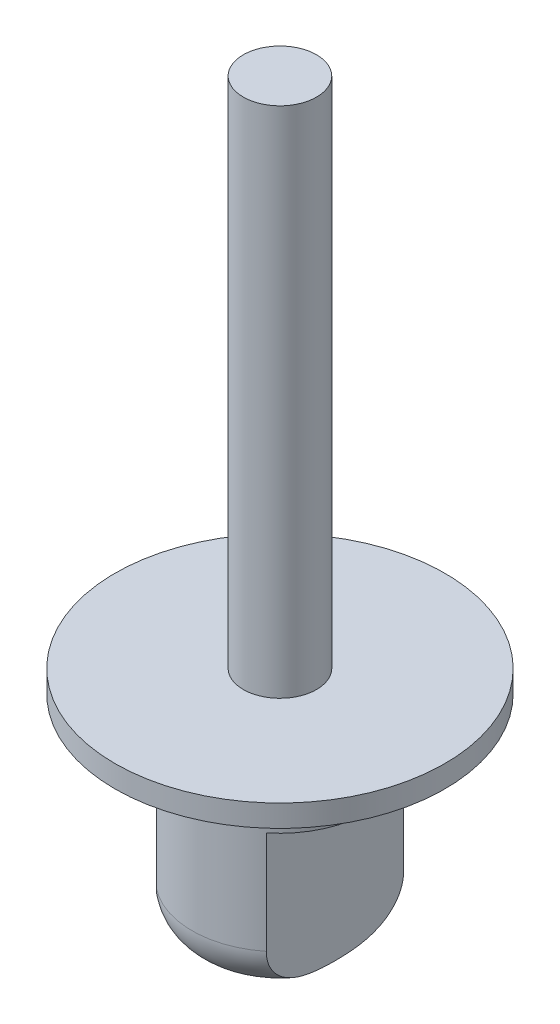
ISO-10303-21;
HEADER;
FILE_DESCRIPTION(('STEP AP214'),'2;1');
FILE_NAME('part.step','',(''),(''),'','','');
FILE_SCHEMA(('AUTOMOTIVE_DESIGN { 1 0 10303 214 1 1 1 1 }'));
ENDSEC;
DATA;
#1=APPLICATION_CONTEXT('core data for automotive mechanical design processes');
#2=APPLICATION_PROTOCOL_DEFINITION('international standard','automotive_design',2000,#1);
#3=PRODUCT_CONTEXT('',#1,'mechanical');
#4=PRODUCT('Part','Part','',(#3));
#5=PRODUCT_RELATED_PRODUCT_CATEGORY('part','',(#4));
#6=PRODUCT_DEFINITION_FORMATION('','',#4);
#7=PRODUCT_DEFINITION_CONTEXT('part definition',#1,'design');
#8=PRODUCT_DEFINITION('design','',#6,#7);
#9=PRODUCT_DEFINITION_SHAPE('','',#8);
#10=(LENGTH_UNIT() NAMED_UNIT(*) SI_UNIT(.MILLI.,.METRE.));
#11=(NAMED_UNIT(*) PLANE_ANGLE_UNIT() SI_UNIT($,.RADIAN.));
#12=(NAMED_UNIT(*) SI_UNIT($,.STERADIAN.) SOLID_ANGLE_UNIT());
#13=UNCERTAINTY_MEASURE_WITH_UNIT(LENGTH_MEASURE(1.E-05),#10,'distance_accuracy_value','');
#14=(GEOMETRIC_REPRESENTATION_CONTEXT(3) GLOBAL_UNCERTAINTY_ASSIGNED_CONTEXT((#13)) GLOBAL_UNIT_ASSIGNED_CONTEXT((#10,
#11,#12)) REPRESENTATION_CONTEXT('',''));
#15=CARTESIAN_POINT('',(0.,0.,0.));
#16=DIRECTION('',(0.,0.,1.));
#17=DIRECTION('',(1.,0.,0.));
#18=AXIS2_PLACEMENT_3D('',#15,#16,#17);
#19=CARTESIAN_POINT('',(0.,3.,0.));
#20=DIRECTION('',(0.,-1.,0.));
#21=DIRECTION('',(0.,0.,-1.));
#22=AXIS2_PLACEMENT_3D('',#19,#20,#21);
#23=CYLINDRICAL_SURFACE('',#22,22.5);
#24=CARTESIAN_POINT('',(0.,3.,0.));
#25=DIRECTION('',(0.,1.,0.));
#26=DIRECTION('',(0.,0.,1.));
#27=AXIS2_PLACEMENT_3D('',#24,#25,#26);
#28=CIRCLE('',#27,22.5);
#29=CARTESIAN_POINT('',(0.,3.,22.5));
#30=VERTEX_POINT('',#29);
#31=EDGE_CURVE('E126',#30,#30,#28,.T.);
#32=ORIENTED_EDGE('',*,*,#31,.F.);
#33=EDGE_LOOP('',(#32));
#34=FACE_BOUND('',#33,.T.);
#35=CARTESIAN_POINT('',(0.,0.,0.));
#36=DIRECTION('',(0.,1.,0.));
#37=DIRECTION('',(0.,0.,1.));
#38=AXIS2_PLACEMENT_3D('',#35,#36,#37);
#39=CIRCLE('',#38,22.5);
#40=CARTESIAN_POINT('',(0.,0.,22.5));
#41=VERTEX_POINT('',#40);
#42=EDGE_CURVE('E122',#41,#41,#39,.T.);
#43=ORIENTED_EDGE('',*,*,#42,.T.);
#44=EDGE_LOOP('',(#43));
#45=FACE_BOUND('',#44,.T.);
#46=ADVANCED_FACE('F39',(#34,#45),#23,.T.);
#47=CARTESIAN_POINT('',(0.,3.,0.));
#48=DIRECTION('',(0.,1.,0.));
#49=DIRECTION('',(0.,0.,1.));
#50=AXIS2_PLACEMENT_3D('',#47,#48,#49);
#51=PLANE('',#50);
#52=CARTESIAN_POINT('',(0.,3.,0.));
#53=DIRECTION('',(0.,1.,0.));
#54=DIRECTION('',(0.,0.,1.));
#55=AXIS2_PLACEMENT_3D('',#52,#53,#54);
#56=CIRCLE('',#55,5.);
#57=CARTESIAN_POINT('',(0.,3.,5.));
#58=VERTEX_POINT('',#57);
#59=EDGE_CURVE('E118',#58,#58,#56,.T.);
#60=ORIENTED_EDGE('',*,*,#59,.F.);
#61=EDGE_LOOP('',(#60));
#62=FACE_BOUND('',#61,.T.);
#63=ORIENTED_EDGE('',*,*,#31,.T.);
#64=EDGE_LOOP('',(#63));
#65=FACE_BOUND('',#64,.T.);
#66=ADVANCED_FACE('F171',(#62,#65),#51,.T.);
#67=CARTESIAN_POINT('',(0.,0.,0.));
#68=DIRECTION('',(0.,1.,0.));
#69=DIRECTION('',(0.,0.,1.));
#70=AXIS2_PLACEMENT_3D('',#67,#68,#69);
#71=PLANE('',#70);
#72=CARTESIAN_POINT('',(0.,0.,0.));
#73=DIRECTION('',(0.,-1.,0.));
#74=DIRECTION('',(0.,0.,-1.));
#75=AXIS2_PLACEMENT_3D('',#72,#73,#74);
#76=CIRCLE('',#75,12.);
#77=CARTESIAN_POINT('',(0.,0.,-12.));
#78=VERTEX_POINT('',#77);
#79=EDGE_CURVE('E113',#78,#78,#76,.T.);
#80=ORIENTED_EDGE('',*,*,#79,.F.);
#81=EDGE_LOOP('',(#80));
#82=FACE_BOUND('',#81,.T.);
#83=ORIENTED_EDGE('',*,*,#42,.F.);
#84=EDGE_LOOP('',(#83));
#85=FACE_BOUND('',#84,.T.);
#86=ADVANCED_FACE('F169',(#82,#85),#71,.F.);
#87=CARTESIAN_POINT('',(0.,73.,0.));
#88=DIRECTION('',(0.,-1.,0.));
#89=DIRECTION('',(0.,0.,-1.));
#90=AXIS2_PLACEMENT_3D('',#87,#88,#89);
#91=CYLINDRICAL_SURFACE('',#90,5.);
#92=CARTESIAN_POINT('',(0.,73.,0.));
#93=DIRECTION('',(0.,1.,0.));
#94=DIRECTION('',(0.,0.,1.));
#95=AXIS2_PLACEMENT_3D('',#92,#93,#94);
#96=CIRCLE('',#95,5.);
#97=CARTESIAN_POINT('',(0.,73.,5.));
#98=VERTEX_POINT('',#97);
#99=EDGE_CURVE('E112',#98,#98,#96,.T.);
#100=ORIENTED_EDGE('',*,*,#99,.F.);
#101=EDGE_LOOP('',(#100));
#102=FACE_BOUND('',#101,.T.);
#103=ORIENTED_EDGE('',*,*,#59,.T.);
#104=EDGE_LOOP('',(#103));
#105=FACE_BOUND('',#104,.T.);
#106=ADVANCED_FACE('F165',(#102,#105),#91,.T.);
#107=CARTESIAN_POINT('',(0.,73.,0.));
#108=DIRECTION('',(0.,1.,0.));
#109=DIRECTION('',(0.,0.,1.));
#110=AXIS2_PLACEMENT_3D('',#107,#108,#109);
#111=PLANE('',#110);
#112=ORIENTED_EDGE('',*,*,#99,.T.);
#113=EDGE_LOOP('',(#112));
#114=FACE_BOUND('',#113,.T.);
#115=ADVANCED_FACE('F162',(#114),#111,.T.);
#116=CARTESIAN_POINT('',(0.,-28.,0.));
#117=DIRECTION('',(0.,1.,0.));
#118=DIRECTION('',(0.,0.,1.));
#119=AXIS2_PLACEMENT_3D('',#116,#117,#118);
#120=CYLINDRICAL_SURFACE('',#119,12.);
#121=CARTESIAN_POINT('',(0.,-22.,0.));
#122=DIRECTION('',(0.,-1.,0.));
#123=DIRECTION('',(0.,0.,-1.));
#124=AXIS2_PLACEMENT_3D('',#121,#122,#123);
#125=CIRCLE('',#124,12.);
#126=CARTESIAN_POINT('',(-7.5,-21.9999999999999,9.36749699759766));
#127=VERTEX_POINT('',#126);
#128=CARTESIAN_POINT('',(7.5,-22.,9.3674969975976));
#129=VERTEX_POINT('',#128);
#130=EDGE_CURVE('E138',#127,#129,#125,.F.);
#131=ORIENTED_EDGE('',*,*,#130,.T.);
#132=DIRECTION('',(0.,1.,0.));
#133=VECTOR('',#132,1.);
#134=CARTESIAN_POINT('',(7.5,-28.,9.3674969975976));
#135=LINE('',#134,#133);
#136=CARTESIAN_POINT('',(7.5,-8.,9.36749699759759));
#137=VERTEX_POINT('',#136);
#138=EDGE_CURVE('E56',#129,#137,#135,.T.);
#139=ORIENTED_EDGE('',*,*,#138,.T.);
#140=CARTESIAN_POINT('',(0.,-8.,0.));
#141=DIRECTION('',(0.,1.,0.));
#142=DIRECTION('',(-1.,0.,0.));
#143=AXIS2_PLACEMENT_3D('',#140,#141,#142);
#144=CIRCLE('',#143,12.);
#145=CARTESIAN_POINT('',(7.5,-8.,-9.3674969975976));
#146=VERTEX_POINT('',#145);
#147=EDGE_CURVE('E11',#137,#146,#144,.T.);
#148=ORIENTED_EDGE('',*,*,#147,.T.);
#149=DIRECTION('',(0.,1.,0.));
#150=VECTOR('',#149,1.);
#151=CARTESIAN_POINT('',(7.5,-28.,-9.3674969975976));
#152=LINE('',#151,#150);
#153=CARTESIAN_POINT('',(7.5,-21.9999999999999,-9.36749699759765));
#154=VERTEX_POINT('',#153);
#155=EDGE_CURVE('E103',#146,#154,#152,.F.);
#156=ORIENTED_EDGE('',*,*,#155,.T.);
#157=CARTESIAN_POINT('',(-7.5,-22.,-9.3674969975976));
#158=VERTEX_POINT('',#157);
#159=EDGE_CURVE('E101',#154,#158,#125,.F.);
#160=ORIENTED_EDGE('',*,*,#159,.T.);
#161=DIRECTION('',(0.,1.,0.));
#162=VECTOR('',#161,1.);
#163=CARTESIAN_POINT('',(-7.49999999999999,-28.,-9.3674969975976));
#164=LINE('',#163,#162);
#165=CARTESIAN_POINT('',(-7.5,-8.,-9.36749699759761));
#166=VERTEX_POINT('',#165);
#167=EDGE_CURVE('E64',#158,#166,#164,.T.);
#168=ORIENTED_EDGE('',*,*,#167,.T.);
#169=CARTESIAN_POINT('',(0.,-8.,0.));
#170=DIRECTION('',(0.,1.,0.));
#171=DIRECTION('',(-1.,0.,0.));
#172=AXIS2_PLACEMENT_3D('',#169,#170,#171);
#173=CIRCLE('',#172,12.);
#174=CARTESIAN_POINT('',(-7.5,-8.,9.36749699759759));
#175=VERTEX_POINT('',#174);
#176=EDGE_CURVE('E49',#166,#175,#173,.T.);
#177=ORIENTED_EDGE('',*,*,#176,.T.);
#178=DIRECTION('',(0.,1.,0.));
#179=VECTOR('',#178,1.);
#180=CARTESIAN_POINT('',(-7.49999999999999,-28.,9.3674969975976));
#181=LINE('',#180,#179);
#182=EDGE_CURVE('E91',#175,#127,#181,.F.);
#183=ORIENTED_EDGE('',*,*,#182,.T.);
#184=EDGE_LOOP('',(#131,#139,#148,#156,#160,#168,#177,#183));
#185=FACE_BOUND('',#184,.T.);
#186=ORIENTED_EDGE('',*,*,#79,.T.);
#187=EDGE_LOOP('',(#186));
#188=FACE_BOUND('',#187,.T.);
#189=ADVANCED_FACE('F97',(#185,#188),#120,.T.);
#190=CARTESIAN_POINT('',(0.,-28.,0.));
#191=DIRECTION('',(0.,-1.,0.));
#192=DIRECTION('',(0.,0.,-1.));
#193=AXIS2_PLACEMENT_3D('',#190,#191,#192);
#194=PLANE('',#193);
#195=CARTESIAN_POINT('',(0.,-28.,0.));
#196=DIRECTION('',(0.,-1.,0.));
#197=DIRECTION('',(0.,0.,-1.));
#198=AXIS2_PLACEMENT_3D('',#195,#196,#197);
#199=CIRCLE('',#198,6.);
#200=CARTESIAN_POINT('',(0.,-28.,-6.));
#201=VERTEX_POINT('',#200);
#202=EDGE_CURVE('E117',#201,#201,#199,.T.);
#203=ORIENTED_EDGE('',*,*,#202,.T.);
#204=EDGE_LOOP('',(#203));
#205=FACE_BOUND('',#204,.T.);
#206=ADVANCED_FACE('F156',(#205),#194,.T.);
#207=CARTESIAN_POINT('',(0.,-22.,0.));
#208=DIRECTION('',(0.,-1.,0.));
#209=DIRECTION('',(0.,0.,-1.));
#210=AXIS2_PLACEMENT_3D('',#207,#208,#209);
#211=TOROIDAL_SURFACE('',#210,6.,6.);
#212=CARTESIAN_POINT('',(7.5,-27.8094750193111,0.));
#213=CARTESIAN_POINT('',(7.5,-27.8094752958151,-0.18452162824242));
#214=CARTESIAN_POINT('',(7.5,-27.8077270322999,-0.369043480287192));
#215=CARTESIAN_POINT('',(7.5,-27.8006130628877,-0.737999394292285));
#216=CARTESIAN_POINT('',(7.5,-27.7952477367066,-0.922433463434386));
#217=CARTESIAN_POINT('',(7.5,-27.780538513706,-1.29122559425462));
#218=CARTESIAN_POINT('',(7.5,-27.7711929215574,-1.47558358999919));
#219=CARTESIAN_POINT('',(7.5,-27.7479507640883,-1.84401846668315));
#220=CARTESIAN_POINT('',(7.5,-27.734054140347,-2.0280953439834));
#221=CARTESIAN_POINT('',(7.5,-27.701027325669,-2.39498843631837));
#222=CARTESIAN_POINT('',(7.5,-27.6819201299087,-2.57780665418327));
#223=CARTESIAN_POINT('',(7.5,-27.6375682217561,-2.94269408038084));
#224=CARTESIAN_POINT('',(7.5,-27.6123230495969,-3.12476323156505));
#225=CARTESIAN_POINT('',(7.5,-27.5259360262262,-3.6691632505479));
#226=CARTESIAN_POINT('',(7.5,-27.4541196223952,-4.02997739530099));
#227=CARTESIAN_POINT('',(7.5,-27.315114172541,-4.57935988961709));
#228=CARTESIAN_POINT('',(7.5,-27.2608348848703,-4.7712225645297));
#229=CARTESIAN_POINT('',(7.5,-27.1402411036094,-5.15109529504943));
#230=CARTESIAN_POINT('',(7.5,-27.0739312594077,-5.3391068078654));
#231=CARTESIAN_POINT('',(7.5,-26.9281486989919,-5.70992505463463));
#232=CARTESIAN_POINT('',(7.5,-26.8486797977089,-5.8927332791208));
#233=CARTESIAN_POINT('',(7.5,-26.6756224712841,-6.25155879665883));
#234=CARTESIAN_POINT('',(7.5,-26.5820364486501,-6.42757723883459));
#235=CARTESIAN_POINT('',(7.5,-26.3958384208508,-6.74413785402998));
#236=CARTESIAN_POINT('',(7.5,-26.3053527427416,-6.8859302136676));
#237=CARTESIAN_POINT('',(7.5,-26.1136422044668,-7.16205254122039));
#238=CARTESIAN_POINT('',(7.5,-26.0124194056704,-7.29638393401336));
#239=CARTESIAN_POINT('',(7.5,-25.7991822855038,-7.55627452274061));
#240=CARTESIAN_POINT('',(7.5,-25.6871652583255,-7.6818315054992));
#241=CARTESIAN_POINT('',(7.5,-25.4525813942248,-7.92270374400352));
#242=CARTESIAN_POINT('',(7.5,-25.3300144777409,-8.03801892249803));
#243=CARTESIAN_POINT('',(7.5,-25.0736714823962,-8.25792234562975));
#244=CARTESIAN_POINT('',(7.5,-24.9398051473305,-8.36240569865935));
#245=CARTESIAN_POINT('',(7.5,-24.662616920615,-8.55796576900282));
#246=CARTESIAN_POINT('',(7.5,-24.5192963548439,-8.64904436046083));
#247=CARTESIAN_POINT('',(7.5,-24.2243409104845,-8.81636481076627));
#248=CARTESIAN_POINT('',(7.5,-24.0727112205184,-8.89261579636783));
#249=CARTESIAN_POINT('',(7.5,-23.7624095052739,-9.02909243430965));
#250=CARTESIAN_POINT('',(7.5,-23.6037388369551,-9.08932115899453));
#251=CARTESIAN_POINT('',(7.5,-23.3052245459151,-9.1849514334904));
#252=CARTESIAN_POINT('',(7.5,-23.166136129491,-9.22272405795733));
#253=CARTESIAN_POINT('',(7.5,-22.8851087613884,-9.28547940350163));
#254=CARTESIAN_POINT('',(7.5,-22.7431701638949,-9.31046370365637));
#255=CARTESIAN_POINT('',(7.5,-22.4576599589478,-9.34730641699015));
#256=CARTESIAN_POINT('',(7.5,-22.3140890586128,-9.35917031033292));
#257=CARTESIAN_POINT('',(7.5,-22.0264648581988,-9.36963164548865));
#258=CARTESIAN_POINT('',(7.5,-21.8824115750842,-9.36822954903947));
#259=CARTESIAN_POINT('',(7.5,-21.6061914815275,-9.35280339576898));
#260=CARTESIAN_POINT('',(7.5,-21.4739684759153,-9.33976569953801));
#261=CARTESIAN_POINT('',(7.5,-21.2110534946456,-9.3025636387872));
#262=CARTESIAN_POINT('',(7.5,-21.0803620180608,-9.27839574533065));
#263=CARTESIAN_POINT('',(7.5,-20.8215410609612,-9.21922065645586));
#264=CARTESIAN_POINT('',(7.5,-20.6934101253726,-9.1842198149556));
#265=CARTESIAN_POINT('',(7.5,-20.4404340442512,-9.1037455253616));
#266=CARTESIAN_POINT('',(7.5,-20.3155901493276,-9.05826815366643));
#267=CARTESIAN_POINT('',(7.5,-20.0692031015505,-8.95699564520569));
#268=CARTESIAN_POINT('',(7.5,-19.9476868658852,-8.90113499399755));
#269=CARTESIAN_POINT('',(7.5,-19.7094920695403,-8.77987692751896));
#270=CARTESIAN_POINT('',(7.5,-19.5928152563103,-8.71447610526942));
#271=CARTESIAN_POINT('',(7.5,-19.2509911073174,-8.50489875856371));
#272=CARTESIAN_POINT('',(7.5,-19.0339195251877,-8.34729299116933));
#273=CARTESIAN_POINT('',(7.5,-18.609337427954,-7.98870608163152));
#274=CARTESIAN_POINT('',(7.5,-18.4039002281567,-7.78529755950601));
#275=CARTESIAN_POINT('',(7.5,-18.0246758733926,-7.35109040646742));
#276=CARTESIAN_POINT('',(7.5,-17.8508837047537,-7.12029612399674));
#277=CARTESIAN_POINT('',(7.5,-17.5744409595824,-6.69864287979114));
#278=CARTESIAN_POINT('',(7.5,-17.4648689537028,-6.51223410047272));
#279=CARTESIAN_POINT('',(7.5,-17.2626904112622,-6.13034538679085));
#280=CARTESIAN_POINT('',(7.5,-17.1700919878543,-5.93486117014358));
#281=CARTESIAN_POINT('',(7.5,-17.0006313082269,-5.53658641063457));
#282=CARTESIAN_POINT('',(7.5,-16.9238147555949,-5.33377659321379));
#283=CARTESIAN_POINT('',(7.5,-16.784875362625,-4.92331428460809));
#284=CARTESIAN_POINT('',(7.5,-16.7227484430634,-4.71566315546473));
#285=CARTESIAN_POINT('',(7.5,-16.5386673542946,-4.02250667384634));
#286=CARTESIAN_POINT('',(7.5,-16.4449803111871,-3.5294265636988));
#287=CARTESIAN_POINT('',(7.5,-16.3412352530644,-2.78498720051465));
#288=CARTESIAN_POINT('',(7.5,-16.3127705467372,-2.53568557770048));
#289=CARTESIAN_POINT('',(7.5,-16.2658269581612,-2.03612434937437));
#290=CARTESIAN_POINT('',(7.5,-16.2473468655649,-1.7858648636814));
#291=CARTESIAN_POINT('',(7.5,-16.2184283009414,-1.28363112408651));
#292=CARTESIAN_POINT('',(7.5,-16.208031590786,-1.0316546617609));
#293=CARTESIAN_POINT('',(7.5,-16.1941849220444,-0.527501194688666));
#294=CARTESIAN_POINT('',(7.5,-16.1907352988047,-0.275324180848896));
#295=CARTESIAN_POINT('',(7.5,-16.1903333462322,0.228731345602991));
#296=CARTESIAN_POINT('',(7.5,-16.193373232494,0.480609853630189));
#297=CARTESIAN_POINT('',(7.5,-16.2063332691715,0.984173581494281));
#298=CARTESIAN_POINT('',(7.5,-16.2162528039696,1.23585881660875));
#299=CARTESIAN_POINT('',(7.5,-16.2454935008677,1.76278825668935));
#300=CARTESIAN_POINT('',(7.5,-16.2656211327378,2.03798990109173));
#301=CARTESIAN_POINT('',(7.5,-16.3180418431018,2.5873134597684));
#302=CARTESIAN_POINT('',(7.5,-16.3503365349836,2.86143522597445));
#303=CARTESIAN_POINT('',(7.5,-16.4300545548583,3.40623279358438));
#304=CARTESIAN_POINT('',(7.5,-16.4774071358833,3.67691867401874));
#305=CARTESIAN_POINT('',(7.5,-16.5907053400646,4.21439476079952));
#306=CARTESIAN_POINT('',(7.5,-16.6566449229111,4.48118620316471));
#307=CARTESIAN_POINT('',(7.5,-16.7911834026755,4.94217748017443));
#308=CARTESIAN_POINT('',(7.5,-16.8549558474619,5.13778160857808));
#309=CARTESIAN_POINT('',(7.5,-16.9961265709521,5.5239942274174));
#310=CARTESIAN_POINT('',(7.5,-17.073520789267,5.71460418712137));
#311=CARTESIAN_POINT('',(7.5,-17.2430793617625,6.0892198722189));
#312=CARTESIAN_POINT('',(7.5,-17.3352463319138,6.27322442084439));
#313=CARTESIAN_POINT('',(7.5,-17.5351759469553,6.63256976145458));
#314=CARTESIAN_POINT('',(7.5,-17.6429345063483,6.80791280693598));
#315=CARTESIAN_POINT('',(7.5,-17.8487615005737,7.10989658300674));
#316=CARTESIAN_POINT('',(7.5,-17.9436617626469,7.2387010399764));
#317=CARTESIAN_POINT('',(7.5,-18.143229826346,7.4885662206622));
#318=CARTESIAN_POINT('',(7.5,-18.2478987883735,7.60962602152205));
#319=CARTESIAN_POINT('',(7.5,-18.4668045949393,7.84271387792474));
#320=CARTESIAN_POINT('',(7.5,-18.5810384459287,7.95474473789612));
#321=CARTESIAN_POINT('',(7.5,-18.8187268203134,8.16854933672494));
#322=CARTESIAN_POINT('',(7.5,-18.9421800591116,8.27032449994957));
#323=CARTESIAN_POINT('',(7.5,-19.1987356397018,8.46313596223061));
#324=CARTESIAN_POINT('',(7.5,-19.3319055781875,8.55408255407203));
#325=CARTESIAN_POINT('',(7.5,-19.6061418402457,8.72304401015934));
#326=CARTESIAN_POINT('',(7.5,-19.747204378254,8.80106500403696));
#327=CARTESIAN_POINT('',(7.5,-20.0362068877473,8.94309470867639));
#328=CARTESIAN_POINT('',(7.5,-20.1841460034049,9.00710515749598));
#329=CARTESIAN_POINT('',(7.5,-20.4856380297523,9.12014361193692));
#330=CARTESIAN_POINT('',(7.5,-20.6391901444676,9.16917373274798));
#331=CARTESIAN_POINT('',(7.5,-20.9313639562727,9.24643392787081));
#332=CARTESIAN_POINT('',(7.5,-21.0695088202567,9.27647685632879));
#333=CARTESIAN_POINT('',(7.5,-21.3479315795213,9.32406143536891));
#334=CARTESIAN_POINT('',(7.5,-21.4882092809527,9.34160421520928));
#335=CARTESIAN_POINT('',(7.5,-21.769719609589,9.36396002322678));
#336=CARTESIAN_POINT('',(7.5,-21.9109518422674,9.3687780225304));
#337=CARTESIAN_POINT('',(7.5,-22.1932734390957,9.3656361390626));
#338=CARTESIAN_POINT('',(7.5,-22.3343628067459,9.35767657732181));
#339=CARTESIAN_POINT('',(7.5,-22.6064011749062,9.32998563551062));
#340=CARTESIAN_POINT('',(7.5,-22.7374295539783,9.31102660205278));
#341=CARTESIAN_POINT('',(7.5,-22.9974780227225,9.26218788836621));
#342=CARTESIAN_POINT('',(7.5,-23.1264974548056,9.23230470755187));
#343=CARTESIAN_POINT('',(7.5,-23.3815508516768,9.16196479385525));
#344=CARTESIAN_POINT('',(7.5,-23.5075862018083,9.12151307666088));
#345=CARTESIAN_POINT('',(7.5,-23.7559772755244,9.03044888037393));
#346=CARTESIAN_POINT('',(7.5,-23.8783315975104,8.97983258590813));
#347=CARTESIAN_POINT('',(7.5,-24.1205569584555,8.86806175742509));
#348=CARTESIAN_POINT('',(7.5,-24.2403549182387,8.8067487702029));
#349=CARTESIAN_POINT('',(7.5,-24.4747211723639,8.67480187441993));
#350=CARTESIAN_POINT('',(7.5,-24.5892875713423,8.60416462323316));
#351=CARTESIAN_POINT('',(7.5,-24.9242270275788,8.37928997825773));
#352=CARTESIAN_POINT('',(7.5,-25.13600210755,8.21201407264851));
#353=CARTESIAN_POINT('',(7.5,-25.5504485361803,7.832942739178));
#354=CARTESIAN_POINT('',(7.5,-25.7507010772538,7.61853228584699));
#355=CARTESIAN_POINT('',(7.5,-26.1185076671662,7.16337882817298));
#356=CARTESIAN_POINT('',(7.5,-26.2860513710234,6.92262753032979));
#357=CARTESIAN_POINT('',(7.5,-26.5545024709803,6.4788664395953));
#358=CARTESIAN_POINT('',(7.5,-26.6619013252763,6.27970729507799));
#359=CARTESIAN_POINT('',(7.5,-26.858559219587,5.87254463104012));
#360=CARTESIAN_POINT('',(7.5,-26.9478095430477,5.664536919364));
#361=CARTESIAN_POINT('',(7.5,-27.1096214973705,5.24180758530232));
#362=CARTESIAN_POINT('',(7.5,-27.1821555960046,5.02707553901331));
#363=CARTESIAN_POINT('',(7.5,-27.3121001369762,4.59305326757355));
#364=CARTESIAN_POINT('',(7.5,-27.3695048137837,4.37376133898656));
#365=CARTESIAN_POINT('',(7.5,-27.4981886749365,3.81417726059936));
#366=CARTESIAN_POINT('',(7.5,-27.5604951716191,3.47183296905169));
#367=CARTESIAN_POINT('',(7.5,-27.6609019684328,2.78359200614869));
#368=CARTESIAN_POINT('',(7.5,-27.6989863972919,2.43769315620305));
#369=CARTESIAN_POINT('',(7.5,-27.7425563308733,1.91723181279187));
#370=CARTESIAN_POINT('',(7.5,-27.7548291128016,1.74318957751326));
#371=CARTESIAN_POINT('',(7.5,-27.7753986995787,1.39487161182967));
#372=CARTESIAN_POINT('',(7.5,-27.7836956019396,1.22059588725638));
#373=CARTESIAN_POINT('',(7.5,-27.796777523185,0.871965392986036));
#374=CARTESIAN_POINT('',(7.5,-27.8015635129394,0.697610658492169));
#375=CARTESIAN_POINT('',(7.5,-27.8079121855994,0.348837350643893));
#376=CARTESIAN_POINT('',(7.5,-27.8094747579462,0.174418775305038));
#377=CARTESIAN_POINT('',(7.5,-27.8094750193111,0.));
#378=B_SPLINE_CURVE_WITH_KNOTS('',3,(#212,#213,#214,#215,#216,#217,#218,#219,#220,#221,#222,
#223,#224,#225,#226,#227,#228,#229,#230,#231,#232,#233,#234,#235,#236,#237,#238,#239,#240,#241,
#242,#243,#244,#245,#246,#247,#248,#249,#250,#251,#252,#253,#254,#255,#256,#257,#258,#259,#260,
#261,#262,#263,#264,#265,#266,#267,#268,#269,#270,#271,#272,#273,#274,#275,#276,#277,#278,#279,
#280,#281,#282,#283,#284,#285,#286,#287,#288,#289,#290,#291,#292,#293,#294,#295,#296,#297,#298,
#299,#300,#301,#302,#303,#304,#305,#306,#307,#308,#309,#310,#311,#312,#313,#314,#315,#316,#317,
#318,#319,#320,#321,#322,#323,#324,#325,#326,#327,#328,#329,#330,#331,#332,#333,#334,#335,#336,
#337,#338,#339,#340,#341,#342,#343,#344,#345,#346,#347,#348,#349,#350,#351,#352,#353,#354,#355,
#356,#357,#358,#359,#360,#361,#362,#363,#364,#365,#366,#367,#368,#369,#370,#371,#372,#373,#374,
#375,#376,#377),.UNSPECIFIED.,.T.,.F.,(4,2,2,2,2,2,2,2,2,2,2,2,2,2,2,2,2,2,2,2,2,2,2,2,2,2,2,2,
2,2,2,2,2,2,2,2,2,2,2,2,2,2,2,2,2,2,2,2,2,2,2,2,2,2,2,2,2,2,2,2,2,2,2,2,2,2,2,2,2,2,2,2,2,2,2,2,
2,2,2,2,2,2,4),(0.,0.553556541747909,1.10705498067111,1.66078940935171,2.21453094651203,
2.7658672034967,3.31724477121586,4.41912680182767,5.01698525599298,5.61461314908643,
6.21206808675635,6.80942146164093,7.31357153503217,7.81762499361292,8.32180513447662,
8.82598907791494,9.33467160980089,9.84328295415677,10.3515802378956,10.8597799828438,
11.291588037567,11.7233427606026,12.1549170790764,12.5864763761707,12.9845986570771,
13.3828472534997,13.7808627038906,14.1790274594522,14.579795450788,14.9807069160888,
15.7821103743006,16.6461503316802,17.5100532757815,18.1578732554314,18.8060020817716,
19.4559821948789,20.1057815998326,21.6069748462106,22.3596793389022,23.1122925673176,
23.8687687149109,24.6252813779039,25.3808870860739,26.1364251884592,26.9640249034878,
27.7917343993232,28.6156111127982,29.4392203950451,30.0559954213971,30.6725869093732,
31.2892877047367,31.9058271963482,32.3853559200308,32.8649416785199,33.3443778968313,
33.823747436381,34.3068464150843,34.7897156366603,35.2725249226045,35.7552660053908,
36.1788379642465,36.6023716529342,37.0257398573389,37.4490974249689,37.8458122806135,
38.2426543730445,38.6393084704929,39.0361117351622,39.4393886143667,39.8428104576491,
40.6491243408277,41.5260051520067,42.4031628508039,43.0810551134699,43.7592721958252,
44.4385984678267,45.1181832448308,46.1608437011148,47.2041866484774,47.7275747628343,
48.2509500399341,48.7741805338585,49.2974289735857),.UNSPECIFIED.);
#379=EDGE_CURVE('E89',#129,#154,#378,.T.);
#380=ORIENTED_EDGE('',*,*,#379,.F.);
#381=ORIENTED_EDGE('',*,*,#130,.F.);
#382=CARTESIAN_POINT('',(-7.5,-27.8094750193111,0.));
#383=CARTESIAN_POINT('',(-7.5,-27.8094752958151,0.184521628242419));
#384=CARTESIAN_POINT('',(-7.5,-27.8077270322999,0.369043480287191));
#385=CARTESIAN_POINT('',(-7.5,-27.8006130628877,0.737999394292284));
#386=CARTESIAN_POINT('',(-7.5,-27.7952477367066,0.922433463434383));
#387=CARTESIAN_POINT('',(-7.5,-27.780538513706,1.29122559425462));
#388=CARTESIAN_POINT('',(-7.5,-27.7711929215574,1.47558358999919));
#389=CARTESIAN_POINT('',(-7.5,-27.7479507640883,1.84401846668315));
#390=CARTESIAN_POINT('',(-7.5,-27.734054140347,2.02809534398339));
#391=CARTESIAN_POINT('',(-7.5,-27.701027325669,2.39498843631837));
#392=CARTESIAN_POINT('',(-7.5,-27.6819201299087,2.57780665418326));
#393=CARTESIAN_POINT('',(-7.5,-27.6375682217561,2.94269408038083));
#394=CARTESIAN_POINT('',(-7.5,-27.6123230495969,3.12476323156505));
#395=CARTESIAN_POINT('',(-7.5,-27.5259360262262,3.6691632505479));
#396=CARTESIAN_POINT('',(-7.5,-27.4541196223952,4.02997739530099));
#397=CARTESIAN_POINT('',(-7.5,-27.315114172541,4.57935988961709));
#398=CARTESIAN_POINT('',(-7.5,-27.2608348848703,4.77122256452969));
#399=CARTESIAN_POINT('',(-7.5,-27.1402411036094,5.15109529504942));
#400=CARTESIAN_POINT('',(-7.5,-27.0739312594077,5.33910680786539));
#401=CARTESIAN_POINT('',(-7.5,-26.928148698992,5.70992505463463));
#402=CARTESIAN_POINT('',(-7.5,-26.8486797977089,5.8927332791208));
#403=CARTESIAN_POINT('',(-7.5,-26.6756224712841,6.25155879665883));
#404=CARTESIAN_POINT('',(-7.5,-26.5820364486502,6.42757723883459));
#405=CARTESIAN_POINT('',(-7.5,-26.3958384208508,6.74413785402998));
#406=CARTESIAN_POINT('',(-7.5,-26.3053527427416,6.8859302136676));
#407=CARTESIAN_POINT('',(-7.5,-26.1136422044668,7.16205254122039));
#408=CARTESIAN_POINT('',(-7.5,-26.0124194056704,7.29638393401336));
#409=CARTESIAN_POINT('',(-7.5,-25.7991822855038,7.55627452274061));
#410=CARTESIAN_POINT('',(-7.5,-25.6871652583255,7.6818315054992));
#411=CARTESIAN_POINT('',(-7.5,-25.4525813942248,7.92270374400352));
#412=CARTESIAN_POINT('',(-7.5,-25.3300144777409,8.03801892249803));
#413=CARTESIAN_POINT('',(-7.5,-25.0736714823962,8.25792234562975));
#414=CARTESIAN_POINT('',(-7.5,-24.9398051473305,8.36240569865935));
#415=CARTESIAN_POINT('',(-7.5,-24.662616920615,8.55796576900282));
#416=CARTESIAN_POINT('',(-7.5,-24.5192963548439,8.64904436046083));
#417=CARTESIAN_POINT('',(-7.5,-24.2243409104845,8.81636481076627));
#418=CARTESIAN_POINT('',(-7.5,-24.0727112205184,8.89261579636784));
#419=CARTESIAN_POINT('',(-7.5,-23.7624095052739,9.02909243430965));
#420=CARTESIAN_POINT('',(-7.5,-23.6037388369551,9.08932115899453));
#421=CARTESIAN_POINT('',(-7.5,-23.3052245459151,9.1849514334904));
#422=CARTESIAN_POINT('',(-7.5,-23.1661361294911,9.22272405795734));
#423=CARTESIAN_POINT('',(-7.5,-22.8851087613884,9.28547940350164));
#424=CARTESIAN_POINT('',(-7.5,-22.7431701638949,9.31046370365637));
#425=CARTESIAN_POINT('',(-7.5,-22.4576599589478,9.34730641699016));
#426=CARTESIAN_POINT('',(-7.5,-22.3140890586128,9.35917031033292));
#427=CARTESIAN_POINT('',(-7.5,-22.0264648581988,9.36963164548865));
#428=CARTESIAN_POINT('',(-7.5,-21.8824115750842,9.36822954903948));
#429=CARTESIAN_POINT('',(-7.5,-21.6061914815275,9.35280339576898));
#430=CARTESIAN_POINT('',(-7.5,-21.4739684759154,9.33976569953801));
#431=CARTESIAN_POINT('',(-7.5,-21.2110534946456,9.30256363878721));
#432=CARTESIAN_POINT('',(-7.5,-21.0803620180608,9.27839574533066));
#433=CARTESIAN_POINT('',(-7.5,-20.8215410609612,9.21922065645586));
#434=CARTESIAN_POINT('',(-7.5,-20.6934101253726,9.18421981495561));
#435=CARTESIAN_POINT('',(-7.5,-20.4404340442512,9.10374552536161));
#436=CARTESIAN_POINT('',(-7.5,-20.3155901493276,9.05826815366643));
#437=CARTESIAN_POINT('',(-7.5,-20.0692031015505,8.95699564520569));
#438=CARTESIAN_POINT('',(-7.5,-19.9476868658852,8.90113499399756));
#439=CARTESIAN_POINT('',(-7.5,-19.7094920695403,8.77987692751897));
#440=CARTESIAN_POINT('',(-7.5,-19.5928152563103,8.71447610526943));
#441=CARTESIAN_POINT('',(-7.5,-19.2509911073174,8.50489875856372));
#442=CARTESIAN_POINT('',(-7.5,-19.0339195251877,8.34729299116935));
#443=CARTESIAN_POINT('',(-7.5,-18.609337427954,7.98870608163153));
#444=CARTESIAN_POINT('',(-7.5,-18.4039002281567,7.78529755950601));
#445=CARTESIAN_POINT('',(-7.5,-18.0246758733926,7.35109040646743));
#446=CARTESIAN_POINT('',(-7.5,-17.8508837047537,7.12029612399674));
#447=CARTESIAN_POINT('',(-7.5,-17.5744409595824,6.69864287979115));
#448=CARTESIAN_POINT('',(-7.5,-17.4648689537028,6.51223410047273));
#449=CARTESIAN_POINT('',(-7.5,-17.2626904112623,6.13034538679086));
#450=CARTESIAN_POINT('',(-7.5,-17.1700919878543,5.93486117014359));
#451=CARTESIAN_POINT('',(-7.5,-17.0006313082269,5.53658641063458));
#452=CARTESIAN_POINT('',(-7.5,-16.9238147555949,5.33377659321381));
#453=CARTESIAN_POINT('',(-7.5,-16.784875362625,4.92331428460811));
#454=CARTESIAN_POINT('',(-7.5,-16.7227484430634,4.71566315546475));
#455=CARTESIAN_POINT('',(-7.5,-16.5386673542946,4.02250667384636));
#456=CARTESIAN_POINT('',(-7.5,-16.4449803111871,3.52942656369883));
#457=CARTESIAN_POINT('',(-7.5,-16.3412352530644,2.78498720051468));
#458=CARTESIAN_POINT('',(-7.5,-16.3127705467372,2.53568557770051));
#459=CARTESIAN_POINT('',(-7.5,-16.2658269581612,2.0361243493744));
#460=CARTESIAN_POINT('',(-7.5,-16.2473468655649,1.78586486368144));
#461=CARTESIAN_POINT('',(-7.5,-16.2184283009414,1.28363112408655));
#462=CARTESIAN_POINT('',(-7.5,-16.208031590786,1.03165466176094));
#463=CARTESIAN_POINT('',(-7.5,-16.1941849220444,0.527501194688707));
#464=CARTESIAN_POINT('',(-7.5,-16.1907352988047,0.27532418084894));
#465=CARTESIAN_POINT('',(-7.5,-16.1903333462322,-0.228731345602946));
#466=CARTESIAN_POINT('',(-7.5,-16.193373232494,-0.480609853630145));
#467=CARTESIAN_POINT('',(-7.5,-16.2063332691715,-0.984173581494236));
#468=CARTESIAN_POINT('',(-7.5,-16.2162528039696,-1.23585881660871));
#469=CARTESIAN_POINT('',(-7.5,-16.2454935008677,-1.7627882566893));
#470=CARTESIAN_POINT('',(-7.5,-16.2656211327378,-2.03798990109168));
#471=CARTESIAN_POINT('',(-7.5,-16.3180418431017,-2.58731345976836));
#472=CARTESIAN_POINT('',(-7.5,-16.3503365349836,-2.86143522597441));
#473=CARTESIAN_POINT('',(-7.5,-16.4300545548583,-3.40623279358435));
#474=CARTESIAN_POINT('',(-7.5,-16.4774071358833,-3.67691867401872));
#475=CARTESIAN_POINT('',(-7.5,-16.5907053400646,-4.2143947607995));
#476=CARTESIAN_POINT('',(-7.5,-16.6566449229111,-4.48118620316469));
#477=CARTESIAN_POINT('',(-7.5,-16.7911834026755,-4.94217748017442));
#478=CARTESIAN_POINT('',(-7.5,-16.8549558474619,-5.13778160857807));
#479=CARTESIAN_POINT('',(-7.5,-16.9961265709521,-5.52399422741739));
#480=CARTESIAN_POINT('',(-7.5,-17.0735207892669,-5.71460418712136));
#481=CARTESIAN_POINT('',(-7.5,-17.2430793617625,-6.08921987221889));
#482=CARTESIAN_POINT('',(-7.5,-17.3352463319138,-6.27322442084438));
#483=CARTESIAN_POINT('',(-7.5,-17.5351759469553,-6.63256976145457));
#484=CARTESIAN_POINT('',(-7.5,-17.6429345063483,-6.80791280693597));
#485=CARTESIAN_POINT('',(-7.5,-17.8487615005736,-7.10989658300674));
#486=CARTESIAN_POINT('',(-7.5,-17.9436617626469,-7.23870103997639));
#487=CARTESIAN_POINT('',(-7.5,-18.143229826346,-7.48856622066219));
#488=CARTESIAN_POINT('',(-7.5,-18.2478987883735,-7.60962602152205));
#489=CARTESIAN_POINT('',(-7.5,-18.4668045949393,-7.84271387792474));
#490=CARTESIAN_POINT('',(-7.5,-18.5810384459287,-7.95474473789612));
#491=CARTESIAN_POINT('',(-7.5,-18.8187268203134,-8.16854933672495));
#492=CARTESIAN_POINT('',(-7.5,-18.9421800591116,-8.27032449994957));
#493=CARTESIAN_POINT('',(-7.5,-19.1987356397018,-8.46313596223061));
#494=CARTESIAN_POINT('',(-7.5,-19.3319055781875,-8.55408255407203));
#495=CARTESIAN_POINT('',(-7.5,-19.6061418402457,-8.72304401015934));
#496=CARTESIAN_POINT('',(-7.5,-19.747204378254,-8.80106500403696));
#497=CARTESIAN_POINT('',(-7.5,-20.0362068877473,-8.94309470867639));
#498=CARTESIAN_POINT('',(-7.5,-20.1841460034049,-9.00710515749598));
#499=CARTESIAN_POINT('',(-7.5,-20.4856380297523,-9.12014361193693));
#500=CARTESIAN_POINT('',(-7.5,-20.6391901444676,-9.16917373274798));
#501=CARTESIAN_POINT('',(-7.5,-20.9313639562727,-9.24643392787081));
#502=CARTESIAN_POINT('',(-7.5,-21.0695088202567,-9.27647685632879));
#503=CARTESIAN_POINT('',(-7.5,-21.3479315795213,-9.32406143536891));
#504=CARTESIAN_POINT('',(-7.5,-21.4882092809526,-9.34160421520928));
#505=CARTESIAN_POINT('',(-7.5,-21.769719609589,-9.36396002322679));
#506=CARTESIAN_POINT('',(-7.5,-21.9109518422674,-9.36877802253041));
#507=CARTESIAN_POINT('',(-7.5,-22.1932734390957,-9.36563613906261));
#508=CARTESIAN_POINT('',(-7.5,-22.3343628067459,-9.35767657732182));
#509=CARTESIAN_POINT('',(-7.5,-22.6064011749062,-9.32998563551062));
#510=CARTESIAN_POINT('',(-7.5,-22.7374295539783,-9.31102660205279));
#511=CARTESIAN_POINT('',(-7.5,-22.9974780227225,-9.26218788836622));
#512=CARTESIAN_POINT('',(-7.5,-23.1264974548056,-9.23230470755188));
#513=CARTESIAN_POINT('',(-7.5,-23.3815508516768,-9.16196479385526));
#514=CARTESIAN_POINT('',(-7.5,-23.5075862018083,-9.12151307666088));
#515=CARTESIAN_POINT('',(-7.5,-23.7559772755244,-9.03044888037393));
#516=CARTESIAN_POINT('',(-7.5,-23.8783315975104,-8.97983258590814));
#517=CARTESIAN_POINT('',(-7.5,-24.1205569584555,-8.8680617574251));
#518=CARTESIAN_POINT('',(-7.5,-24.2403549182387,-8.80674877020291));
#519=CARTESIAN_POINT('',(-7.5,-24.4747211723639,-8.67480187441993));
#520=CARTESIAN_POINT('',(-7.5,-24.5892875713423,-8.60416462323317));
#521=CARTESIAN_POINT('',(-7.5,-24.9242270275788,-8.37928997825773));
#522=CARTESIAN_POINT('',(-7.5,-25.13600210755,-8.21201407264852));
#523=CARTESIAN_POINT('',(-7.5,-25.5504485361803,-7.832942739178));
#524=CARTESIAN_POINT('',(-7.5,-25.7507010772538,-7.618532285847));
#525=CARTESIAN_POINT('',(-7.5,-26.1185076671662,-7.16337882817298));
#526=CARTESIAN_POINT('',(-7.5,-26.2860513710234,-6.9226275303298));
#527=CARTESIAN_POINT('',(-7.5,-26.5545024709803,-6.4788664395953));
#528=CARTESIAN_POINT('',(-7.5,-26.6619013252763,-6.279707295078));
#529=CARTESIAN_POINT('',(-7.5,-26.858559219587,-5.87254463104013));
#530=CARTESIAN_POINT('',(-7.5,-26.9478095430477,-5.66453691936401));
#531=CARTESIAN_POINT('',(-7.5,-27.1096214973705,-5.24180758530233));
#532=CARTESIAN_POINT('',(-7.5,-27.1821555960046,-5.02707553901332));
#533=CARTESIAN_POINT('',(-7.5,-27.3121001369762,-4.59305326757356));
#534=CARTESIAN_POINT('',(-7.5,-27.3695048137837,-4.37376133898656));
#535=CARTESIAN_POINT('',(-7.5,-27.4981886749365,-3.81417726059937));
#536=CARTESIAN_POINT('',(-7.5,-27.5604951716191,-3.47183296905169));
#537=CARTESIAN_POINT('',(-7.5,-27.6609019684328,-2.78359200614869));
#538=CARTESIAN_POINT('',(-7.5,-27.6989863972919,-2.43769315620305));
#539=CARTESIAN_POINT('',(-7.5,-27.7425563308733,-1.91723181279188));
#540=CARTESIAN_POINT('',(-7.5,-27.7548291128016,-1.74318957751326));
#541=CARTESIAN_POINT('',(-7.5,-27.7753986995787,-1.39487161182967));
#542=CARTESIAN_POINT('',(-7.5,-27.7836956019396,-1.22059588725638));
#543=CARTESIAN_POINT('',(-7.5,-27.796777523185,-0.87196539298604));
#544=CARTESIAN_POINT('',(-7.5,-27.8015635129394,-0.697610658492172));
#545=CARTESIAN_POINT('',(-7.5,-27.8079121855994,-0.348837350643895));
#546=CARTESIAN_POINT('',(-7.5,-27.8094747579462,-0.174418775305039));
#547=CARTESIAN_POINT('',(-7.5,-27.8094750193111,0.));
#548=B_SPLINE_CURVE_WITH_KNOTS('',3,(#382,#383,#384,#385,#386,#387,#388,#389,#390,#391,#392,
#393,#394,#395,#396,#397,#398,#399,#400,#401,#402,#403,#404,#405,#406,#407,#408,#409,#410,#411,
#412,#413,#414,#415,#416,#417,#418,#419,#420,#421,#422,#423,#424,#425,#426,#427,#428,#429,#430,
#431,#432,#433,#434,#435,#436,#437,#438,#439,#440,#441,#442,#443,#444,#445,#446,#447,#448,#449,
#450,#451,#452,#453,#454,#455,#456,#457,#458,#459,#460,#461,#462,#463,#464,#465,#466,#467,#468,
#469,#470,#471,#472,#473,#474,#475,#476,#477,#478,#479,#480,#481,#482,#483,#484,#485,#486,#487,
#488,#489,#490,#491,#492,#493,#494,#495,#496,#497,#498,#499,#500,#501,#502,#503,#504,#505,#506,
#507,#508,#509,#510,#511,#512,#513,#514,#515,#516,#517,#518,#519,#520,#521,#522,#523,#524,#525,
#526,#527,#528,#529,#530,#531,#532,#533,#534,#535,#536,#537,#538,#539,#540,#541,#542,#543,#544,
#545,#546,#547),.UNSPECIFIED.,.T.,.F.,(4,2,2,2,2,2,2,2,2,2,2,2,2,2,2,2,2,2,2,2,2,2,2,2,2,2,2,2,
2,2,2,2,2,2,2,2,2,2,2,2,2,2,2,2,2,2,2,2,2,2,2,2,2,2,2,2,2,2,2,2,2,2,2,2,2,2,2,2,2,2,2,2,2,2,2,2,
2,2,2,2,2,2,4),(0.,0.553556541747908,1.10705498067111,1.6607894093517,2.21453094651203,
2.76586720349669,3.31724477121585,4.41912680182766,5.01698525599297,5.61461314908642,
6.21206808675634,6.80942146164093,7.31357153503217,7.81762499361292,8.32180513447662,
8.82598907791493,9.33467160980088,9.84328295415676,10.3515802378956,10.8597799828438,
11.291588037567,11.7233427606026,12.1549170790764,12.5864763761706,12.9845986570771,
13.3828472534997,13.7808627038906,14.1790274594522,14.579795450788,14.9807069160888,
15.7821103743006,16.6461503316802,17.5100532757815,18.1578732554314,18.8060020817716,
19.4559821948789,20.1057815998326,21.6069748462105,22.3596793389022,23.1122925673176,
23.8687687149109,24.6252813779039,25.3808870860738,26.1364251884592,26.9640249034878,
27.7917343993232,28.6156111127982,29.4392203950451,30.0559954213971,30.6725869093733,
31.2892877047367,31.9058271963483,32.3853559200308,32.8649416785199,33.3443778968313,
33.823747436381,34.3068464150843,34.7897156366604,35.2725249226045,35.7552660053908,
36.1788379642465,36.6023716529343,37.0257398573389,37.4490974249689,37.8458122806135,
38.2426543730445,38.639308470493,39.0361117351622,39.4393886143668,39.8428104576492,
40.6491243408277,41.5260051520067,42.403162850804,43.0810551134699,43.7592721958252,
44.4385984678267,45.1181832448308,46.1608437011148,47.2041866484774,47.7275747628343,
48.2509500399341,48.7741805338585,49.2974289735857),.UNSPECIFIED.);
#549=EDGE_CURVE('E139',#158,#127,#548,.T.);
#550=ORIENTED_EDGE('',*,*,#549,.F.);
#551=ORIENTED_EDGE('',*,*,#159,.F.);
#552=EDGE_LOOP('',(#380,#381,#550,#551));
#553=FACE_BOUND('',#552,.T.);
#554=ORIENTED_EDGE('',*,*,#202,.F.);
#555=EDGE_LOOP('',(#554));
#556=FACE_BOUND('',#555,.T.);
#557=ADVANCED_FACE('F41',(#553,#556),#211,.T.);
#558=CARTESIAN_POINT('',(-27.07,-8.00000000000001,-22.5));
#559=DIRECTION('',(0.,1.,0.));
#560=DIRECTION('',(-1.,0.,0.));
#561=AXIS2_PLACEMENT_3D('',#558,#559,#560);
#562=PLANE('',#561);
#563=DIRECTION('',(0.,0.,1.));
#564=VECTOR('',#563,1.);
#565=CARTESIAN_POINT('',(-7.5,-8.,-22.5));
#566=LINE('',#565,#564);
#567=EDGE_CURVE('E85',#166,#175,#566,.T.);
#568=ORIENTED_EDGE('',*,*,#567,.T.);
#569=ORIENTED_EDGE('',*,*,#176,.F.);
#570=EDGE_LOOP('',(#568,#569));
#571=FACE_BOUND('',#570,.T.);
#572=ADVANCED_FACE('F84',(#571),#562,.F.);
#573=CARTESIAN_POINT('',(-7.5,-8.,-22.5));
#574=DIRECTION('',(1.,0.,0.));
#575=DIRECTION('',(0.,1.,0.));
#576=AXIS2_PLACEMENT_3D('',#573,#574,#575);
#577=PLANE('',#576);
#578=ORIENTED_EDGE('',*,*,#549,.T.);
#579=ORIENTED_EDGE('',*,*,#182,.F.);
#580=ORIENTED_EDGE('',*,*,#567,.F.);
#581=ORIENTED_EDGE('',*,*,#167,.F.);
#582=EDGE_LOOP('',(#578,#579,#580,#581));
#583=FACE_BOUND('',#582,.T.);
#584=ADVANCED_FACE('F90',(#583),#577,.F.);
#585=CARTESIAN_POINT('',(27.07,-8.,-22.5));
#586=DIRECTION('',(0.,1.,0.));
#587=DIRECTION('',(-1.,0.,0.));
#588=AXIS2_PLACEMENT_3D('',#585,#586,#587);
#589=PLANE('',#588);
#590=DIRECTION('',(0.,0.,1.));
#591=VECTOR('',#590,1.);
#592=CARTESIAN_POINT('',(7.5,-8.,-22.5));
#593=LINE('',#592,#591);
#594=EDGE_CURVE('E93',#146,#137,#593,.T.);
#595=ORIENTED_EDGE('',*,*,#594,.F.);
#596=ORIENTED_EDGE('',*,*,#147,.F.);
#597=EDGE_LOOP('',(#595,#596));
#598=FACE_BOUND('',#597,.T.);
#599=ADVANCED_FACE('F154',(#598),#589,.F.);
#600=CARTESIAN_POINT('',(7.5,-8.,-22.5));
#601=DIRECTION('',(-1.,0.,0.));
#602=DIRECTION('',(0.,-1.,0.));
#603=AXIS2_PLACEMENT_3D('',#600,#601,#602);
#604=PLANE('',#603);
#605=ORIENTED_EDGE('',*,*,#379,.T.);
#606=ORIENTED_EDGE('',*,*,#155,.F.);
#607=ORIENTED_EDGE('',*,*,#594,.T.);
#608=ORIENTED_EDGE('',*,*,#138,.F.);
#609=EDGE_LOOP('',(#605,#606,#607,#608));
#610=FACE_BOUND('',#609,.T.);
#611=ADVANCED_FACE('F231',(#610),#604,.F.);
#612=CLOSED_SHELL('',(#46,#66,#86,#106,#115,#189,#206,#557,#572,#584,#599,#611));
#613=MANIFOLD_SOLID_BREP('B2',#612);
#614=ADVANCED_BREP_SHAPE_REPRESENTATION('',(#18,#613),#14);
#615=SHAPE_DEFINITION_REPRESENTATION(#9,#614);
ENDSEC;
END-ISO-10303-21;
